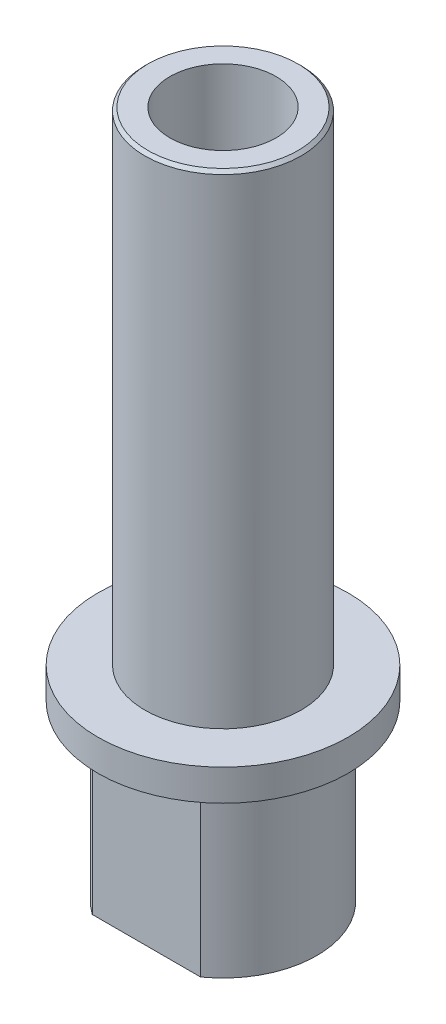
ISO-10303-21;
HEADER;
FILE_DESCRIPTION(('STEP AP214'),'2;1');
FILE_NAME('part.step','',(''),(''),'','','');
FILE_SCHEMA(('AUTOMOTIVE_DESIGN { 1 0 10303 214 1 1 1 1 }'));
ENDSEC;
DATA;
#1=APPLICATION_CONTEXT('core data for automotive mechanical design processes');
#2=APPLICATION_PROTOCOL_DEFINITION('international standard','automotive_design',2000,#1);
#3=PRODUCT_CONTEXT('',#1,'mechanical');
#4=PRODUCT('Part','Part','',(#3));
#5=PRODUCT_RELATED_PRODUCT_CATEGORY('part','',(#4));
#6=PRODUCT_DEFINITION_FORMATION('','',#4);
#7=PRODUCT_DEFINITION_CONTEXT('part definition',#1,'design');
#8=PRODUCT_DEFINITION('design','',#6,#7);
#9=PRODUCT_DEFINITION_SHAPE('','',#8);
#10=(LENGTH_UNIT() NAMED_UNIT(*) SI_UNIT(.MILLI.,.METRE.));
#11=(NAMED_UNIT(*) PLANE_ANGLE_UNIT() SI_UNIT($,.RADIAN.));
#12=(NAMED_UNIT(*) SI_UNIT($,.STERADIAN.) SOLID_ANGLE_UNIT());
#13=UNCERTAINTY_MEASURE_WITH_UNIT(LENGTH_MEASURE(1.E-05),#10,'distance_accuracy_value','');
#14=(GEOMETRIC_REPRESENTATION_CONTEXT(3) GLOBAL_UNCERTAINTY_ASSIGNED_CONTEXT((#13)) GLOBAL_UNIT_ASSIGNED_CONTEXT((#10,
#11,#12)) REPRESENTATION_CONTEXT('',''));
#15=CARTESIAN_POINT('',(0.,0.,0.));
#16=DIRECTION('',(0.,0.,1.));
#17=DIRECTION('',(1.,0.,0.));
#18=AXIS2_PLACEMENT_3D('',#15,#16,#17);
#19=CARTESIAN_POINT('',(3.49148336110938E-12,-1000.,0.));
#20=DIRECTION('',(0.,-1.,0.));
#21=DIRECTION('',(1.,0.,0.));
#22=AXIS2_PLACEMENT_3D('',#19,#20,#21);
#23=CYLINDRICAL_SURFACE('',#22,6.00000000000002);
#24=DIRECTION('',(0.,-1.,0.));
#25=VECTOR('',#24,1.);
#26=CARTESIAN_POINT('',(3.46265793863609,18.1121323433033,-4.9));
#27=LINE('',#26,#25);
#28=CARTESIAN_POINT('',(3.46265793863612,11.1,-4.9));
#29=VERTEX_POINT('',#28);
#30=CARTESIAN_POINT('',(3.46265793863616,0.,-4.9));
#31=VERTEX_POINT('',#30);
#32=EDGE_CURVE('E111',#29,#31,#27,.T.);
#33=ORIENTED_EDGE('',*,*,#32,.F.);
#34=CARTESIAN_POINT('',(0.,11.1000000000001,0.));
#35=DIRECTION('',(0.,-1.,0.));
#36=DIRECTION('',(1.,0.,0.));
#37=AXIS2_PLACEMENT_3D('',#34,#35,#36);
#38=CIRCLE('',#37,6.00000000000004);
#39=CARTESIAN_POINT('',(3.46265793863619,11.1000000000001,4.9));
#40=VERTEX_POINT('',#39);
#41=EDGE_CURVE('E62',#29,#40,#38,.T.);
#42=ORIENTED_EDGE('',*,*,#41,.T.);
#43=DIRECTION('',(0.,-1.,0.));
#44=VECTOR('',#43,1.);
#45=CARTESIAN_POINT('',(3.46265793863609,18.1121323433033,4.9));
#46=LINE('',#45,#44);
#47=CARTESIAN_POINT('',(3.46265793863616,0.,4.9));
#48=VERTEX_POINT('',#47);
#49=EDGE_CURVE('E118',#40,#48,#46,.T.);
#50=ORIENTED_EDGE('',*,*,#49,.T.);
#51=CARTESIAN_POINT('',(0.,0.,0.));
#52=DIRECTION('',(0.,-1.,0.));
#53=DIRECTION('',(1.,0.,0.));
#54=AXIS2_PLACEMENT_3D('',#51,#52,#53);
#55=CIRCLE('',#54,6.);
#56=EDGE_CURVE('E135',#31,#48,#55,.T.);
#57=ORIENTED_EDGE('',*,*,#56,.F.);
#58=EDGE_LOOP('',(#33,#42,#50,#57));
#59=FACE_BOUND('',#58,.T.);
#60=ADVANCED_FACE('F39',(#59),#23,.T.);
#61=CARTESIAN_POINT('',(0.,0.,0.));
#62=DIRECTION('',(0.,-1.,0.));
#63=DIRECTION('',(1.,0.,0.));
#64=AXIS2_PLACEMENT_3D('',#61,#62,#63);
#65=PLANE('',#64);
#66=CARTESIAN_POINT('',(0.,0.,0.));
#67=DIRECTION('',(0.,-1.,0.));
#68=DIRECTION('',(0.,0.,-1.));
#69=AXIS2_PLACEMENT_3D('',#66,#67,#68);
#70=CIRCLE('',#69,3.39999999999999);
#71=CARTESIAN_POINT('',(0.,0.,-3.39999999999999));
#72=VERTEX_POINT('',#71);
#73=EDGE_CURVE('E97',#72,#72,#70,.T.);
#74=ORIENTED_EDGE('',*,*,#73,.F.);
#75=EDGE_LOOP('',(#74));
#76=FACE_BOUND('',#75,.T.);
#77=DIRECTION('',(-1.,0.,0.));
#78=VECTOR('',#77,1.);
#79=CARTESIAN_POINT('',(-3.46265793863616,0.,-4.9));
#80=LINE('',#79,#78);
#81=CARTESIAN_POINT('',(-3.46265793863616,0.,-4.9));
#82=VERTEX_POINT('',#81);
#83=EDGE_CURVE('E107',#31,#82,#80,.T.);
#84=ORIENTED_EDGE('',*,*,#83,.F.);
#85=ORIENTED_EDGE('',*,*,#56,.T.);
#86=DIRECTION('',(1.,0.,0.));
#87=VECTOR('',#86,1.);
#88=CARTESIAN_POINT('',(-3.46265793863616,0.,4.9));
#89=LINE('',#88,#87);
#90=CARTESIAN_POINT('',(-3.46265793863616,0.,4.9));
#91=VERTEX_POINT('',#90);
#92=EDGE_CURVE('E110',#91,#48,#89,.T.);
#93=ORIENTED_EDGE('',*,*,#92,.F.);
#94=EDGE_CURVE('E136',#91,#82,#55,.T.);
#95=ORIENTED_EDGE('',*,*,#94,.T.);
#96=EDGE_LOOP('',(#84,#85,#93,#95));
#97=FACE_BOUND('',#96,.T.);
#98=ADVANCED_FACE('F152',(#76,#97),#65,.T.);
#99=DIRECTION('',(0.,-1.,0.));
#100=VECTOR('',#99,1.);
#101=CARTESIAN_POINT('',(-3.46265793863622,18.1121323433033,-4.9));
#102=LINE('',#101,#100);
#103=CARTESIAN_POINT('',(-3.4626579386362,11.1000000000001,-4.90000000000005));
#104=VERTEX_POINT('',#103);
#105=EDGE_CURVE('E54',#104,#82,#102,.T.);
#106=ORIENTED_EDGE('',*,*,#105,.T.);
#107=ORIENTED_EDGE('',*,*,#94,.F.);
#108=DIRECTION('',(0.,-1.,0.));
#109=VECTOR('',#108,1.);
#110=CARTESIAN_POINT('',(-3.46265793863622,18.1121323433033,4.9));
#111=LINE('',#110,#109);
#112=CARTESIAN_POINT('',(-3.46265793863622,11.1,4.9));
#113=VERTEX_POINT('',#112);
#114=EDGE_CURVE('E117',#113,#91,#111,.T.);
#115=ORIENTED_EDGE('',*,*,#114,.F.);
#116=EDGE_CURVE('E132',#113,#104,#38,.T.);
#117=ORIENTED_EDGE('',*,*,#116,.T.);
#118=EDGE_LOOP('',(#106,#107,#115,#117));
#119=FACE_BOUND('',#118,.T.);
#120=ADVANCED_FACE('F154',(#119),#23,.T.);
#121=CARTESIAN_POINT('',(6.,11.1,0.));
#122=DIRECTION('',(0.,-1.,0.));
#123=DIRECTION('',(1.,0.,0.));
#124=AXIS2_PLACEMENT_3D('',#121,#122,#123);
#125=PLANE('',#124);
#126=ORIENTED_EDGE('',*,*,#41,.F.);
#127=DIRECTION('',(1.,0.,0.));
#128=VECTOR('',#127,1.);
#129=CARTESIAN_POINT('',(-3.4626579386362,11.1,-4.9));
#130=LINE('',#129,#128);
#131=EDGE_CURVE('E108',#104,#29,#130,.T.);
#132=ORIENTED_EDGE('',*,*,#131,.F.);
#133=ORIENTED_EDGE('',*,*,#116,.F.);
#134=DIRECTION('',(-1.,0.,0.));
#135=VECTOR('',#134,1.);
#136=CARTESIAN_POINT('',(-3.4626579386362,11.1,4.9));
#137=LINE('',#136,#135);
#138=EDGE_CURVE('E120',#40,#113,#137,.T.);
#139=ORIENTED_EDGE('',*,*,#138,.F.);
#140=EDGE_LOOP('',(#126,#132,#133,#139));
#141=FACE_BOUND('',#140,.T.);
#142=CARTESIAN_POINT('',(0.,11.1000000000001,0.));
#143=DIRECTION('',(0.,-1.,0.));
#144=DIRECTION('',(1.,0.,0.));
#145=AXIS2_PLACEMENT_3D('',#142,#143,#144);
#146=CIRCLE('',#145,8.00000000000004);
#147=CARTESIAN_POINT('',(8.,11.1000000000001,0.));
#148=VERTEX_POINT('',#147);
#149=EDGE_CURVE('E129',#148,#148,#146,.T.);
#150=ORIENTED_EDGE('',*,*,#149,.T.);
#151=EDGE_LOOP('',(#150));
#152=FACE_BOUND('',#151,.T.);
#153=ADVANCED_FACE('F161',(#141,#152),#125,.T.);
#154=CARTESIAN_POINT('',(3.49148336110938E-12,-1000.,0.));
#155=DIRECTION('',(0.,-1.,0.));
#156=DIRECTION('',(1.,0.,0.));
#157=AXIS2_PLACEMENT_3D('',#154,#155,#156);
#158=CYLINDRICAL_SURFACE('',#157,8.00000000000004);
#159=CARTESIAN_POINT('',(0.,13.1000000000001,0.));
#160=DIRECTION('',(0.,-1.,0.));
#161=DIRECTION('',(1.,0.,0.));
#162=AXIS2_PLACEMENT_3D('',#159,#160,#161);
#163=CIRCLE('',#162,8.00000000000004);
#164=CARTESIAN_POINT('',(8.,13.1000000000001,0.));
#165=VERTEX_POINT('',#164);
#166=EDGE_CURVE('E126',#165,#165,#163,.T.);
#167=ORIENTED_EDGE('',*,*,#166,.T.);
#168=EDGE_LOOP('',(#167));
#169=FACE_BOUND('',#168,.T.);
#170=ORIENTED_EDGE('',*,*,#149,.F.);
#171=EDGE_LOOP('',(#170));
#172=FACE_BOUND('',#171,.T.);
#173=ADVANCED_FACE('F166',(#169,#172),#158,.T.);
#174=CARTESIAN_POINT('',(8.,13.1,0.));
#175=DIRECTION('',(0.,1.,0.));
#176=DIRECTION('',(-1.,0.,0.));
#177=AXIS2_PLACEMENT_3D('',#174,#175,#176);
#178=PLANE('',#177);
#179=CARTESIAN_POINT('',(0.,13.1000000000001,0.));
#180=DIRECTION('',(0.,-1.,0.));
#181=DIRECTION('',(1.,0.,0.));
#182=AXIS2_PLACEMENT_3D('',#179,#180,#181);
#183=CIRCLE('',#182,5.00000000000005);
#184=CARTESIAN_POINT('',(5.,13.1000000000001,0.));
#185=VERTEX_POINT('',#184);
#186=EDGE_CURVE('E123',#185,#185,#183,.T.);
#187=ORIENTED_EDGE('',*,*,#186,.T.);
#188=EDGE_LOOP('',(#187));
#189=FACE_BOUND('',#188,.T.);
#190=ORIENTED_EDGE('',*,*,#166,.F.);
#191=EDGE_LOOP('',(#190));
#192=FACE_BOUND('',#191,.T.);
#193=ADVANCED_FACE('F198',(#189,#192),#178,.T.);
#194=CARTESIAN_POINT('',(3.49148336110938E-12,-1000.,0.));
#195=DIRECTION('',(0.,-1.,0.));
#196=DIRECTION('',(1.,0.,0.));
#197=AXIS2_PLACEMENT_3D('',#194,#195,#196);
#198=CYLINDRICAL_SURFACE('',#197,5.0000000000001);
#199=CARTESIAN_POINT('',(-1.5292697121659E-13,43.7999999999998,0.));
#200=DIRECTION('',(0.,1.,0.));
#201=DIRECTION('',(-1.,0.,0.));
#202=AXIS2_PLACEMENT_3D('',#199,#200,#201);
#203=CIRCLE('',#202,5.0000000000001);
#204=CARTESIAN_POINT('',(-5.00000000000025,43.7999999999998,0.));
#205=VERTEX_POINT('',#204);
#206=EDGE_CURVE('E47',#205,#205,#203,.F.);
#207=ORIENTED_EDGE('',*,*,#206,.T.);
#208=EDGE_LOOP('',(#207));
#209=FACE_BOUND('',#208,.T.);
#210=ORIENTED_EDGE('',*,*,#186,.F.);
#211=EDGE_LOOP('',(#210));
#212=FACE_BOUND('',#211,.T.);
#213=ADVANCED_FACE('F141',(#209,#212),#198,.T.);
#214=CARTESIAN_POINT('',(5.,44.,0.));
#215=DIRECTION('',(0.,1.,0.));
#216=DIRECTION('',(-1.,0.,0.));
#217=AXIS2_PLACEMENT_3D('',#214,#215,#216);
#218=PLANE('',#217);
#219=CARTESIAN_POINT('',(-1.53625267888813E-13,44.,0.));
#220=DIRECTION('',(0.,1.,0.));
#221=DIRECTION('',(-1.,0.,0.));
#222=AXIS2_PLACEMENT_3D('',#219,#220,#221);
#223=CIRCLE('',#222,4.79999999999997);
#224=CARTESIAN_POINT('',(-4.80000000000013,44.,0.));
#225=VERTEX_POINT('',#224);
#226=EDGE_CURVE('E11',#225,#225,#223,.T.);
#227=ORIENTED_EDGE('',*,*,#226,.T.);
#228=EDGE_LOOP('',(#227));
#229=FACE_BOUND('',#228,.T.);
#230=CARTESIAN_POINT('',(-1.53625267888813E-13,44.,0.));
#231=DIRECTION('',(0.,1.,0.));
#232=DIRECTION('',(0.,0.,1.));
#233=AXIS2_PLACEMENT_3D('',#230,#231,#232);
#234=CIRCLE('',#233,3.4);
#235=CARTESIAN_POINT('',(-1.53625267888813E-13,44.,3.4));
#236=VERTEX_POINT('',#235);
#237=EDGE_CURVE('E96',#236,#236,#234,.T.);
#238=ORIENTED_EDGE('',*,*,#237,.F.);
#239=EDGE_LOOP('',(#238));
#240=FACE_BOUND('',#239,.T.);
#241=ADVANCED_FACE('F189',(#229,#240),#218,.T.);
#242=CARTESIAN_POINT('',(-3.46265793863622,18.1121323433033,4.9));
#243=DIRECTION('',(0.,0.,-1.));
#244=DIRECTION('',(-1.,0.,0.));
#245=AXIS2_PLACEMENT_3D('',#242,#243,#244);
#246=PLANE('',#245);
#247=ORIENTED_EDGE('',*,*,#138,.T.);
#248=ORIENTED_EDGE('',*,*,#114,.T.);
#249=ORIENTED_EDGE('',*,*,#92,.T.);
#250=ORIENTED_EDGE('',*,*,#49,.F.);
#251=EDGE_LOOP('',(#247,#248,#249,#250));
#252=FACE_BOUND('',#251,.T.);
#253=ADVANCED_FACE('F177',(#252),#246,.F.);
#254=CARTESIAN_POINT('',(-3.46265793863622,18.1121323433033,-4.9));
#255=DIRECTION('',(0.,0.,1.));
#256=DIRECTION('',(1.,0.,0.));
#257=AXIS2_PLACEMENT_3D('',#254,#255,#256);
#258=PLANE('',#257);
#259=ORIENTED_EDGE('',*,*,#131,.T.);
#260=ORIENTED_EDGE('',*,*,#32,.T.);
#261=ORIENTED_EDGE('',*,*,#83,.T.);
#262=ORIENTED_EDGE('',*,*,#105,.F.);
#263=EDGE_LOOP('',(#259,#260,#261,#262));
#264=FACE_BOUND('',#263,.T.);
#265=ADVANCED_FACE('F179',(#264),#258,.F.);
#266=CARTESIAN_POINT('',(-1.53625267888813E-13,24.25,0.));
#267=DIRECTION('',(0.,1.,0.));
#268=DIRECTION('',(0.,0.,1.));
#269=AXIS2_PLACEMENT_3D('',#266,#267,#268);
#270=CONICAL_SURFACE('',#269,3.4,1.02974425867665);
#271=CARTESIAN_POINT('',(-1.58962995328446E-13,22.2070738953063,0.));
#272=VERTEX_POINT('',#271);
#273=VERTEX_LOOP('',#272);
#274=FACE_BOUND('',#273,.T.);
#275=CARTESIAN_POINT('',(-1.53625267888813E-13,24.25,0.));
#276=DIRECTION('',(0.,1.,0.));
#277=DIRECTION('',(0.,0.,1.));
#278=AXIS2_PLACEMENT_3D('',#275,#276,#277);
#279=CIRCLE('',#278,3.4);
#280=CARTESIAN_POINT('',(-1.53625267888813E-13,24.25,3.4));
#281=VERTEX_POINT('',#280);
#282=EDGE_CURVE('E100',#281,#281,#279,.T.);
#283=ORIENTED_EDGE('',*,*,#282,.T.);
#284=EDGE_LOOP('',(#283));
#285=FACE_BOUND('',#284,.T.);
#286=ADVANCED_FACE('F181',(#274,#285),#270,.F.);
#287=CARTESIAN_POINT('',(-1.53625267888813E-13,44.,0.));
#288=DIRECTION('',(0.,1.,0.));
#289=DIRECTION('',(0.,0.,1.));
#290=AXIS2_PLACEMENT_3D('',#287,#288,#289);
#291=CYLINDRICAL_SURFACE('',#290,3.4);
#292=ORIENTED_EDGE('',*,*,#282,.F.);
#293=EDGE_LOOP('',(#292));
#294=FACE_BOUND('',#293,.T.);
#295=ORIENTED_EDGE('',*,*,#237,.T.);
#296=EDGE_LOOP('',(#295));
#297=FACE_BOUND('',#296,.T.);
#298=ADVANCED_FACE('F90',(#294,#297),#291,.F.);
#299=CARTESIAN_POINT('',(0.,19.75,0.));
#300=DIRECTION('',(0.,-1.,0.));
#301=DIRECTION('',(0.,0.,-1.));
#302=AXIS2_PLACEMENT_3D('',#299,#300,#301);
#303=CONICAL_SURFACE('',#302,3.39999999999999,1.02974425867665);
#304=CARTESIAN_POINT('',(0.,21.7929261046937,0.));
#305=VERTEX_POINT('',#304);
#306=VERTEX_LOOP('',#305);
#307=FACE_BOUND('',#306,.T.);
#308=CARTESIAN_POINT('',(0.,19.75,0.));
#309=DIRECTION('',(0.,-1.,0.));
#310=DIRECTION('',(0.,0.,-1.));
#311=AXIS2_PLACEMENT_3D('',#308,#309,#310);
#312=CIRCLE('',#311,3.39999999999999);
#313=CARTESIAN_POINT('',(0.,19.75,-3.39999999999999));
#314=VERTEX_POINT('',#313);
#315=EDGE_CURVE('E94',#314,#314,#312,.T.);
#316=ORIENTED_EDGE('',*,*,#315,.T.);
#317=EDGE_LOOP('',(#316));
#318=FACE_BOUND('',#317,.T.);
#319=ADVANCED_FACE('F86',(#307,#318),#303,.F.);
#320=CARTESIAN_POINT('',(0.,0.,0.));
#321=DIRECTION('',(0.,-1.,0.));
#322=DIRECTION('',(0.,0.,-1.));
#323=AXIS2_PLACEMENT_3D('',#320,#321,#322);
#324=CYLINDRICAL_SURFACE('',#323,3.39999999999999);
#325=ORIENTED_EDGE('',*,*,#315,.F.);
#326=EDGE_LOOP('',(#325));
#327=FACE_BOUND('',#326,.T.);
#328=ORIENTED_EDGE('',*,*,#73,.T.);
#329=EDGE_LOOP('',(#328));
#330=FACE_BOUND('',#329,.T.);
#331=ADVANCED_FACE('F89',(#327,#330),#324,.F.);
#332=CARTESIAN_POINT('',(-1.5292697121659E-13,43.7999999999998,0.));
#333=DIRECTION('',(0.,-1.,0.));
#334=DIRECTION('',(1.,0.,0.));
#335=AXIS2_PLACEMENT_3D('',#332,#333,#334);
#336=CONICAL_SURFACE('',#335,5.0000000000001,0.78539816339739);
#337=ORIENTED_EDGE('',*,*,#226,.F.);
#338=EDGE_LOOP('',(#337));
#339=FACE_BOUND('',#338,.T.);
#340=ORIENTED_EDGE('',*,*,#206,.F.);
#341=EDGE_LOOP('',(#340));
#342=FACE_BOUND('',#341,.T.);
#343=ADVANCED_FACE('F41',(#339,#342),#336,.T.);
#344=CLOSED_SHELL('',(#60,#98,#120,#153,#173,#193,#213,#241,#253,#265,#286,#298,#319,#331,#343));
#345=MANIFOLD_SOLID_BREP('B2',#344);
#346=ADVANCED_BREP_SHAPE_REPRESENTATION('',(#18,#345),#14);
#347=SHAPE_DEFINITION_REPRESENTATION(#9,#346);
ENDSEC;
END-ISO-10303-21;
